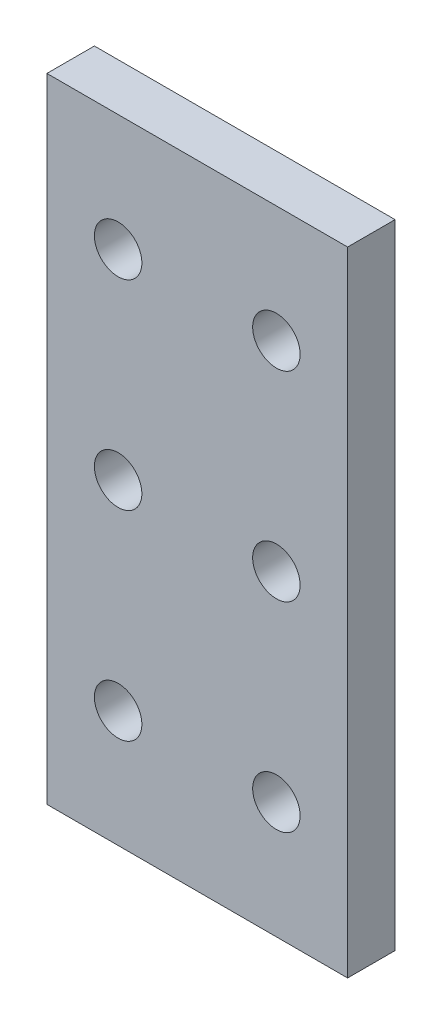
ISO-10303-21;
HEADER;
FILE_DESCRIPTION(('STEP AP214'),'2;1');
FILE_NAME('part.step','',(''),(''),'','','');
FILE_SCHEMA(('AUTOMOTIVE_DESIGN { 1 0 10303 214 1 1 1 1 }'));
ENDSEC;
DATA;
#1=APPLICATION_CONTEXT('core data for automotive mechanical design processes');
#2=APPLICATION_PROTOCOL_DEFINITION('international standard','automotive_design',2000,#1);
#3=PRODUCT_CONTEXT('',#1,'mechanical');
#4=PRODUCT('Part','Part','',(#3));
#5=PRODUCT_RELATED_PRODUCT_CATEGORY('part','',(#4));
#6=PRODUCT_DEFINITION_FORMATION('','',#4);
#7=PRODUCT_DEFINITION_CONTEXT('part definition',#1,'design');
#8=PRODUCT_DEFINITION('design','',#6,#7);
#9=PRODUCT_DEFINITION_SHAPE('','',#8);
#10=(LENGTH_UNIT() NAMED_UNIT(*) SI_UNIT(.MILLI.,.METRE.));
#11=(NAMED_UNIT(*) PLANE_ANGLE_UNIT() SI_UNIT($,.RADIAN.));
#12=(NAMED_UNIT(*) SI_UNIT($,.STERADIAN.) SOLID_ANGLE_UNIT());
#13=UNCERTAINTY_MEASURE_WITH_UNIT(LENGTH_MEASURE(1.E-05),#10,'distance_accuracy_value','');
#14=(GEOMETRIC_REPRESENTATION_CONTEXT(3) GLOBAL_UNCERTAINTY_ASSIGNED_CONTEXT((#13)) GLOBAL_UNIT_ASSIGNED_CONTEXT((#10,
#11,#12)) REPRESENTATION_CONTEXT('',''));
#15=CARTESIAN_POINT('',(0.,0.,0.));
#16=DIRECTION('',(0.,0.,1.));
#17=DIRECTION('',(1.,0.,0.));
#18=AXIS2_PLACEMENT_3D('',#15,#16,#17);
#19=CARTESIAN_POINT('',(0.,0.,3.));
#20=DIRECTION('',(0.,0.,-1.));
#21=DIRECTION('',(-1.,0.,0.));
#22=AXIS2_PLACEMENT_3D('',#19,#20,#21);
#23=PLANE('',#22);
#24=CARTESIAN_POINT('',(-14.5,-12.625,3.));
#25=DIRECTION('',(0.,0.,1.));
#26=DIRECTION('',(1.,0.,0.));
#27=AXIS2_PLACEMENT_3D('',#24,#25,#26);
#28=CIRCLE('',#27,1.5);
#29=CARTESIAN_POINT('',(-13.,-12.625,3.));
#30=VERTEX_POINT('',#29);
#31=EDGE_CURVE('E132',#30,#30,#28,.T.);
#32=ORIENTED_EDGE('',*,*,#31,.F.);
#33=EDGE_LOOP('',(#32));
#34=FACE_BOUND('',#33,.T.);
#35=CARTESIAN_POINT('',(-4.5,-12.625,3.));
#36=DIRECTION('',(0.,0.,1.));
#37=DIRECTION('',(1.,0.,0.));
#38=AXIS2_PLACEMENT_3D('',#35,#36,#37);
#39=CIRCLE('',#38,1.5);
#40=CARTESIAN_POINT('',(-3.,-12.625,3.));
#41=VERTEX_POINT('',#40);
#42=EDGE_CURVE('E120',#41,#41,#39,.T.);
#43=ORIENTED_EDGE('',*,*,#42,.F.);
#44=EDGE_LOOP('',(#43));
#45=FACE_BOUND('',#44,.T.);
#46=CARTESIAN_POINT('',(-4.5,12.625,3.));
#47=DIRECTION('',(0.,0.,1.));
#48=DIRECTION('',(-1.,0.,0.));
#49=AXIS2_PLACEMENT_3D('',#46,#47,#48);
#50=CIRCLE('',#49,1.5);
#51=CARTESIAN_POINT('',(-6.,12.625,3.));
#52=VERTEX_POINT('',#51);
#53=EDGE_CURVE('E99',#52,#52,#50,.T.);
#54=ORIENTED_EDGE('',*,*,#53,.F.);
#55=EDGE_LOOP('',(#54));
#56=FACE_BOUND('',#55,.T.);
#57=DIRECTION('',(1.,0.,0.));
#58=VECTOR('',#57,1.);
#59=CARTESIAN_POINT('',(0.,-20.,3.));
#60=LINE('',#59,#58);
#61=CARTESIAN_POINT('',(-19.,-20.,3.));
#62=VERTEX_POINT('',#61);
#63=CARTESIAN_POINT('',(0.,-20.,3.));
#64=VERTEX_POINT('',#63);
#65=EDGE_CURVE('E84',#62,#64,#60,.T.);
#66=ORIENTED_EDGE('',*,*,#65,.T.);
#67=DIRECTION('',(0.,1.,0.));
#68=VECTOR('',#67,1.);
#69=CARTESIAN_POINT('',(0.,-20.,3.));
#70=LINE('',#69,#68);
#71=CARTESIAN_POINT('',(0.,20.,3.));
#72=VERTEX_POINT('',#71);
#73=EDGE_CURVE('E79',#64,#72,#70,.T.);
#74=ORIENTED_EDGE('',*,*,#73,.T.);
#75=DIRECTION('',(-1.,0.,0.));
#76=VECTOR('',#75,1.);
#77=CARTESIAN_POINT('',(0.,20.,3.));
#78=LINE('',#77,#76);
#79=CARTESIAN_POINT('',(-19.,20.,3.));
#80=VERTEX_POINT('',#79);
#81=EDGE_CURVE('E82',#72,#80,#78,.T.);
#82=ORIENTED_EDGE('',*,*,#81,.T.);
#83=DIRECTION('',(0.,-1.,0.));
#84=VECTOR('',#83,1.);
#85=CARTESIAN_POINT('',(-19.,-20.,3.));
#86=LINE('',#85,#84);
#87=EDGE_CURVE('E49',#80,#62,#86,.T.);
#88=ORIENTED_EDGE('',*,*,#87,.T.);
#89=EDGE_LOOP('',(#66,#74,#82,#88));
#90=FACE_BOUND('',#89,.T.);
#91=CARTESIAN_POINT('',(-14.5,12.625,3.));
#92=DIRECTION('',(0.,0.,1.));
#93=DIRECTION('',(-1.,0.,0.));
#94=AXIS2_PLACEMENT_3D('',#91,#92,#93);
#95=CIRCLE('',#94,1.5);
#96=CARTESIAN_POINT('',(-16.,12.625,3.));
#97=VERTEX_POINT('',#96);
#98=EDGE_CURVE('E114',#97,#97,#95,.T.);
#99=ORIENTED_EDGE('',*,*,#98,.F.);
#100=EDGE_LOOP('',(#99));
#101=FACE_BOUND('',#100,.T.);
#102=CARTESIAN_POINT('',(-4.5,0.,3.));
#103=DIRECTION('',(0.,0.,1.));
#104=DIRECTION('',(1.,0.,0.));
#105=AXIS2_PLACEMENT_3D('',#102,#103,#104);
#106=CIRCLE('',#105,1.5);
#107=CARTESIAN_POINT('',(-3.,0.,3.));
#108=VERTEX_POINT('',#107);
#109=EDGE_CURVE('E126',#108,#108,#106,.T.);
#110=ORIENTED_EDGE('',*,*,#109,.F.);
#111=EDGE_LOOP('',(#110));
#112=FACE_BOUND('',#111,.T.);
#113=CARTESIAN_POINT('',(-14.5,0.,3.));
#114=DIRECTION('',(0.,0.,1.));
#115=DIRECTION('',(1.,0.,0.));
#116=AXIS2_PLACEMENT_3D('',#113,#114,#115);
#117=CIRCLE('',#116,1.5);
#118=CARTESIAN_POINT('',(-13.,0.,3.));
#119=VERTEX_POINT('',#118);
#120=EDGE_CURVE('E138',#119,#119,#117,.T.);
#121=ORIENTED_EDGE('',*,*,#120,.F.);
#122=EDGE_LOOP('',(#121));
#123=FACE_BOUND('',#122,.T.);
#124=ADVANCED_FACE('F32',(#34,#45,#56,#90,#101,#112,#123),#23,.F.);
#125=CARTESIAN_POINT('',(0.,0.,0.));
#126=DIRECTION('',(0.,0.,-1.));
#127=DIRECTION('',(-1.,0.,0.));
#128=AXIS2_PLACEMENT_3D('',#125,#126,#127);
#129=PLANE('',#128);
#130=CARTESIAN_POINT('',(-14.5,-12.625,0.));
#131=DIRECTION('',(0.,0.,1.));
#132=DIRECTION('',(1.,0.,0.));
#133=AXIS2_PLACEMENT_3D('',#130,#131,#132);
#134=CIRCLE('',#133,1.5);
#135=CARTESIAN_POINT('',(-13.,-12.625,0.));
#136=VERTEX_POINT('',#135);
#137=EDGE_CURVE('E135',#136,#136,#134,.T.);
#138=ORIENTED_EDGE('',*,*,#137,.T.);
#139=EDGE_LOOP('',(#138));
#140=FACE_BOUND('',#139,.T.);
#141=CARTESIAN_POINT('',(-4.5,-12.625,0.));
#142=DIRECTION('',(0.,0.,1.));
#143=DIRECTION('',(1.,0.,0.));
#144=AXIS2_PLACEMENT_3D('',#141,#142,#143);
#145=CIRCLE('',#144,1.5);
#146=CARTESIAN_POINT('',(-3.,-12.625,0.));
#147=VERTEX_POINT('',#146);
#148=EDGE_CURVE('E123',#147,#147,#145,.T.);
#149=ORIENTED_EDGE('',*,*,#148,.T.);
#150=EDGE_LOOP('',(#149));
#151=FACE_BOUND('',#150,.T.);
#152=CARTESIAN_POINT('',(-4.5,12.625,0.));
#153=DIRECTION('',(0.,0.,1.));
#154=DIRECTION('',(-1.,0.,0.));
#155=AXIS2_PLACEMENT_3D('',#152,#153,#154);
#156=CIRCLE('',#155,1.5);
#157=CARTESIAN_POINT('',(-6.,12.625,0.));
#158=VERTEX_POINT('',#157);
#159=EDGE_CURVE('E111',#158,#158,#156,.T.);
#160=ORIENTED_EDGE('',*,*,#159,.T.);
#161=EDGE_LOOP('',(#160));
#162=FACE_BOUND('',#161,.T.);
#163=DIRECTION('',(1.,0.,0.));
#164=VECTOR('',#163,1.);
#165=CARTESIAN_POINT('',(0.,-20.,0.));
#166=LINE('',#165,#164);
#167=CARTESIAN_POINT('',(-19.,-20.,0.));
#168=VERTEX_POINT('',#167);
#169=CARTESIAN_POINT('',(0.,-20.,0.));
#170=VERTEX_POINT('',#169);
#171=EDGE_CURVE('E96',#168,#170,#166,.T.);
#172=ORIENTED_EDGE('',*,*,#171,.F.);
#173=DIRECTION('',(0.,-1.,0.));
#174=VECTOR('',#173,1.);
#175=CARTESIAN_POINT('',(-19.,-20.,0.));
#176=LINE('',#175,#174);
#177=CARTESIAN_POINT('',(-19.,20.,0.));
#178=VERTEX_POINT('',#177);
#179=EDGE_CURVE('E72',#178,#168,#176,.T.);
#180=ORIENTED_EDGE('',*,*,#179,.F.);
#181=DIRECTION('',(-1.,0.,0.));
#182=VECTOR('',#181,1.);
#183=CARTESIAN_POINT('',(0.,20.,0.));
#184=LINE('',#183,#182);
#185=CARTESIAN_POINT('',(0.,20.,0.));
#186=VERTEX_POINT('',#185);
#187=EDGE_CURVE('E66',#186,#178,#184,.T.);
#188=ORIENTED_EDGE('',*,*,#187,.F.);
#189=DIRECTION('',(0.,1.,0.));
#190=VECTOR('',#189,1.);
#191=CARTESIAN_POINT('',(0.,-20.,0.));
#192=LINE('',#191,#190);
#193=EDGE_CURVE('E88',#170,#186,#192,.T.);
#194=ORIENTED_EDGE('',*,*,#193,.F.);
#195=EDGE_LOOP('',(#172,#180,#188,#194));
#196=FACE_BOUND('',#195,.T.);
#197=CARTESIAN_POINT('',(-14.5,12.625,0.));
#198=DIRECTION('',(0.,0.,1.));
#199=DIRECTION('',(-1.,0.,0.));
#200=AXIS2_PLACEMENT_3D('',#197,#198,#199);
#201=CIRCLE('',#200,1.5);
#202=CARTESIAN_POINT('',(-16.,12.625,0.));
#203=VERTEX_POINT('',#202);
#204=EDGE_CURVE('E117',#203,#203,#201,.T.);
#205=ORIENTED_EDGE('',*,*,#204,.T.);
#206=EDGE_LOOP('',(#205));
#207=FACE_BOUND('',#206,.T.);
#208=CARTESIAN_POINT('',(-4.5,0.,0.));
#209=DIRECTION('',(0.,0.,1.));
#210=DIRECTION('',(1.,0.,0.));
#211=AXIS2_PLACEMENT_3D('',#208,#209,#210);
#212=CIRCLE('',#211,1.5);
#213=CARTESIAN_POINT('',(-3.,0.,0.));
#214=VERTEX_POINT('',#213);
#215=EDGE_CURVE('E129',#214,#214,#212,.T.);
#216=ORIENTED_EDGE('',*,*,#215,.T.);
#217=EDGE_LOOP('',(#216));
#218=FACE_BOUND('',#217,.T.);
#219=CARTESIAN_POINT('',(-14.5,0.,0.));
#220=DIRECTION('',(0.,0.,1.));
#221=DIRECTION('',(1.,0.,0.));
#222=AXIS2_PLACEMENT_3D('',#219,#220,#221);
#223=CIRCLE('',#222,1.5);
#224=CARTESIAN_POINT('',(-13.,0.,0.));
#225=VERTEX_POINT('',#224);
#226=EDGE_CURVE('E141',#225,#225,#223,.T.);
#227=ORIENTED_EDGE('',*,*,#226,.T.);
#228=EDGE_LOOP('',(#227));
#229=FACE_BOUND('',#228,.T.);
#230=ADVANCED_FACE('F107',(#140,#151,#162,#196,#207,#218,#229),#129,.T.);
#231=CARTESIAN_POINT('',(0.,-20.,3.));
#232=DIRECTION('',(0.,1.,0.));
#233=DIRECTION('',(-1.,0.,0.));
#234=AXIS2_PLACEMENT_3D('',#231,#232,#233);
#235=PLANE('',#234);
#236=ORIENTED_EDGE('',*,*,#171,.T.);
#237=DIRECTION('',(0.,0.,-1.));
#238=VECTOR('',#237,1.);
#239=CARTESIAN_POINT('',(0.,-20.,3.));
#240=LINE('',#239,#238);
#241=EDGE_CURVE('E11',#64,#170,#240,.T.);
#242=ORIENTED_EDGE('',*,*,#241,.F.);
#243=ORIENTED_EDGE('',*,*,#65,.F.);
#244=DIRECTION('',(0.,0.,-1.));
#245=VECTOR('',#244,1.);
#246=CARTESIAN_POINT('',(-19.,-20.,3.));
#247=LINE('',#246,#245);
#248=EDGE_CURVE('E92',#62,#168,#247,.T.);
#249=ORIENTED_EDGE('',*,*,#248,.T.);
#250=EDGE_LOOP('',(#236,#242,#243,#249));
#251=FACE_BOUND('',#250,.T.);
#252=ADVANCED_FACE('F34',(#251),#235,.F.);
#253=CARTESIAN_POINT('',(0.,-20.,3.));
#254=DIRECTION('',(-1.,0.,0.));
#255=DIRECTION('',(0.,-1.,0.));
#256=AXIS2_PLACEMENT_3D('',#253,#254,#255);
#257=PLANE('',#256);
#258=ORIENTED_EDGE('',*,*,#193,.T.);
#259=DIRECTION('',(0.,0.,-1.));
#260=VECTOR('',#259,1.);
#261=CARTESIAN_POINT('',(0.,20.,3.));
#262=LINE('',#261,#260);
#263=EDGE_CURVE('E41',#72,#186,#262,.T.);
#264=ORIENTED_EDGE('',*,*,#263,.F.);
#265=ORIENTED_EDGE('',*,*,#73,.F.);
#266=ORIENTED_EDGE('',*,*,#241,.T.);
#267=EDGE_LOOP('',(#258,#264,#265,#266));
#268=FACE_BOUND('',#267,.T.);
#269=ADVANCED_FACE('F87',(#268),#257,.F.);
#270=CARTESIAN_POINT('',(0.,20.,3.));
#271=DIRECTION('',(0.,-1.,0.));
#272=DIRECTION('',(0.,0.,-1.));
#273=AXIS2_PLACEMENT_3D('',#270,#271,#272);
#274=PLANE('',#273);
#275=ORIENTED_EDGE('',*,*,#187,.T.);
#276=DIRECTION('',(0.,0.,-1.));
#277=VECTOR('',#276,1.);
#278=CARTESIAN_POINT('',(-19.,20.,3.));
#279=LINE('',#278,#277);
#280=EDGE_CURVE('E89',#80,#178,#279,.T.);
#281=ORIENTED_EDGE('',*,*,#280,.F.);
#282=ORIENTED_EDGE('',*,*,#81,.F.);
#283=ORIENTED_EDGE('',*,*,#263,.T.);
#284=EDGE_LOOP('',(#275,#281,#282,#283));
#285=FACE_BOUND('',#284,.T.);
#286=ADVANCED_FACE('F90',(#285),#274,.F.);
#287=CARTESIAN_POINT('',(-19.,-20.,3.));
#288=DIRECTION('',(1.,0.,0.));
#289=DIRECTION('',(0.,1.,0.));
#290=AXIS2_PLACEMENT_3D('',#287,#288,#289);
#291=PLANE('',#290);
#292=ORIENTED_EDGE('',*,*,#179,.T.);
#293=ORIENTED_EDGE('',*,*,#248,.F.);
#294=ORIENTED_EDGE('',*,*,#87,.F.);
#295=ORIENTED_EDGE('',*,*,#280,.T.);
#296=EDGE_LOOP('',(#292,#293,#294,#295));
#297=FACE_BOUND('',#296,.T.);
#298=ADVANCED_FACE('F104',(#297),#291,.F.);
#299=CARTESIAN_POINT('',(-4.5,12.625,3.));
#300=DIRECTION('',(0.,0.,-1.));
#301=DIRECTION('',(-1.,0.,0.));
#302=AXIS2_PLACEMENT_3D('',#299,#300,#301);
#303=CYLINDRICAL_SURFACE('',#302,1.5);
#304=ORIENTED_EDGE('',*,*,#53,.T.);
#305=EDGE_LOOP('',(#304));
#306=FACE_BOUND('',#305,.T.);
#307=ORIENTED_EDGE('',*,*,#159,.F.);
#308=EDGE_LOOP('',(#307));
#309=FACE_BOUND('',#308,.T.);
#310=ADVANCED_FACE('F161',(#306,#309),#303,.F.);
#311=CARTESIAN_POINT('',(-14.5,12.625,3.));
#312=DIRECTION('',(0.,0.,-1.));
#313=DIRECTION('',(-1.,0.,0.));
#314=AXIS2_PLACEMENT_3D('',#311,#312,#313);
#315=CYLINDRICAL_SURFACE('',#314,1.5);
#316=ORIENTED_EDGE('',*,*,#98,.T.);
#317=EDGE_LOOP('',(#316));
#318=FACE_BOUND('',#317,.T.);
#319=ORIENTED_EDGE('',*,*,#204,.F.);
#320=EDGE_LOOP('',(#319));
#321=FACE_BOUND('',#320,.T.);
#322=ADVANCED_FACE('F207',(#318,#321),#315,.F.);
#323=CARTESIAN_POINT('',(-4.5,-12.625,3.));
#324=DIRECTION('',(0.,0.,-1.));
#325=DIRECTION('',(-1.,0.,0.));
#326=AXIS2_PLACEMENT_3D('',#323,#324,#325);
#327=CYLINDRICAL_SURFACE('',#326,1.5);
#328=ORIENTED_EDGE('',*,*,#42,.T.);
#329=EDGE_LOOP('',(#328));
#330=FACE_BOUND('',#329,.T.);
#331=ORIENTED_EDGE('',*,*,#148,.F.);
#332=EDGE_LOOP('',(#331));
#333=FACE_BOUND('',#332,.T.);
#334=ADVANCED_FACE('F215',(#330,#333),#327,.F.);
#335=CARTESIAN_POINT('',(-4.5,0.,3.));
#336=DIRECTION('',(0.,0.,-1.));
#337=DIRECTION('',(-1.,0.,0.));
#338=AXIS2_PLACEMENT_3D('',#335,#336,#337);
#339=CYLINDRICAL_SURFACE('',#338,1.5);
#340=ORIENTED_EDGE('',*,*,#109,.T.);
#341=EDGE_LOOP('',(#340));
#342=FACE_BOUND('',#341,.T.);
#343=ORIENTED_EDGE('',*,*,#215,.F.);
#344=EDGE_LOOP('',(#343));
#345=FACE_BOUND('',#344,.T.);
#346=ADVANCED_FACE('F223',(#342,#345),#339,.F.);
#347=CARTESIAN_POINT('',(-14.5,-12.625,3.));
#348=DIRECTION('',(0.,0.,-1.));
#349=DIRECTION('',(-1.,0.,0.));
#350=AXIS2_PLACEMENT_3D('',#347,#348,#349);
#351=CYLINDRICAL_SURFACE('',#350,1.5);
#352=ORIENTED_EDGE('',*,*,#31,.T.);
#353=EDGE_LOOP('',(#352));
#354=FACE_BOUND('',#353,.T.);
#355=ORIENTED_EDGE('',*,*,#137,.F.);
#356=EDGE_LOOP('',(#355));
#357=FACE_BOUND('',#356,.T.);
#358=ADVANCED_FACE('F232',(#354,#357),#351,.F.);
#359=CARTESIAN_POINT('',(-14.5,0.,3.));
#360=DIRECTION('',(0.,0.,-1.));
#361=DIRECTION('',(-1.,0.,0.));
#362=AXIS2_PLACEMENT_3D('',#359,#360,#361);
#363=CYLINDRICAL_SURFACE('',#362,1.5);
#364=ORIENTED_EDGE('',*,*,#120,.T.);
#365=EDGE_LOOP('',(#364));
#366=FACE_BOUND('',#365,.T.);
#367=ORIENTED_EDGE('',*,*,#226,.F.);
#368=EDGE_LOOP('',(#367));
#369=FACE_BOUND('',#368,.T.);
#370=ADVANCED_FACE('F147',(#366,#369),#363,.F.);
#371=CLOSED_SHELL('',(#124,#230,#252,#269,#286,#298,#310,#322,#334,#346,#358,#370));
#372=MANIFOLD_SOLID_BREP('B2',#371);
#373=ADVANCED_BREP_SHAPE_REPRESENTATION('',(#18,#372),#14);
#374=SHAPE_DEFINITION_REPRESENTATION(#9,#373);
ENDSEC;
END-ISO-10303-21;
